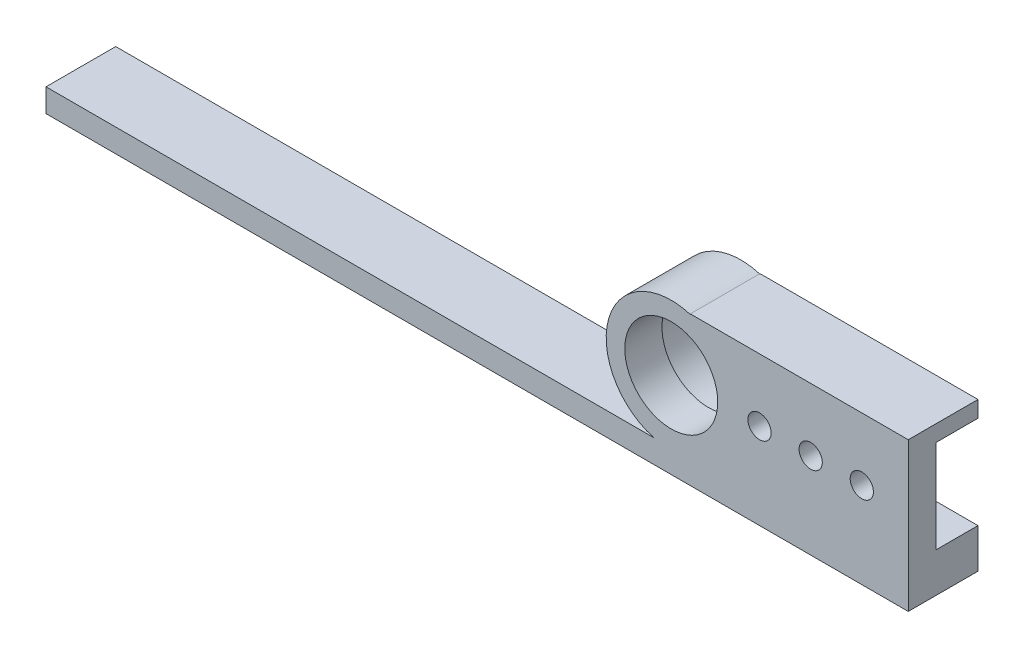
ISO-10303-21;
HEADER;
FILE_DESCRIPTION(('STEP AP214'),'2;1');
FILE_NAME('part.step','',(''),(''),'','','');
FILE_SCHEMA(('AUTOMOTIVE_DESIGN { 1 0 10303 214 1 1 1 1 }'));
ENDSEC;
DATA;
#1=APPLICATION_CONTEXT('core data for automotive mechanical design processes');
#2=APPLICATION_PROTOCOL_DEFINITION('international standard','automotive_design',2000,#1);
#3=PRODUCT_CONTEXT('',#1,'mechanical');
#4=PRODUCT('Part','Part','',(#3));
#5=PRODUCT_RELATED_PRODUCT_CATEGORY('part','',(#4));
#6=PRODUCT_DEFINITION_FORMATION('','',#4);
#7=PRODUCT_DEFINITION_CONTEXT('part definition',#1,'design');
#8=PRODUCT_DEFINITION('design','',#6,#7);
#9=PRODUCT_DEFINITION_SHAPE('','',#8);
#10=(LENGTH_UNIT() NAMED_UNIT(*) SI_UNIT(.MILLI.,.METRE.));
#11=(NAMED_UNIT(*) PLANE_ANGLE_UNIT() SI_UNIT($,.RADIAN.));
#12=(NAMED_UNIT(*) SI_UNIT($,.STERADIAN.) SOLID_ANGLE_UNIT());
#13=UNCERTAINTY_MEASURE_WITH_UNIT(LENGTH_MEASURE(1.E-05),#10,'distance_accuracy_value','');
#14=(GEOMETRIC_REPRESENTATION_CONTEXT(3) GLOBAL_UNCERTAINTY_ASSIGNED_CONTEXT((#13)) GLOBAL_UNIT_ASSIGNED_CONTEXT((#10,
#11,#12)) REPRESENTATION_CONTEXT('',''));
#15=CARTESIAN_POINT('',(0.,0.,0.));
#16=DIRECTION('',(0.,0.,1.));
#17=DIRECTION('',(1.,0.,0.));
#18=AXIS2_PLACEMENT_3D('',#15,#16,#17);
#19=CARTESIAN_POINT('',(-31.,0.,-9.));
#20=DIRECTION('',(0.,0.,1.));
#21=DIRECTION('',(1.,0.,0.));
#22=AXIS2_PLACEMENT_3D('',#19,#20,#21);
#23=CYLINDRICAL_SURFACE('',#22,14.);
#24=DIRECTION('',(0.,0.,1.));
#25=VECTOR('',#24,1.);
#26=CARTESIAN_POINT('',(-34.7080992435478,-13.5,-9.));
#27=LINE('',#26,#25);
#28=CARTESIAN_POINT('',(-34.7080992435478,-13.5,6.));
#29=VERTEX_POINT('',#28);
#30=CARTESIAN_POINT('',(-34.7080992435478,-13.5,-9.));
#31=VERTEX_POINT('',#30);
#32=EDGE_CURVE('E158',#29,#31,#27,.F.);
#33=ORIENTED_EDGE('',*,*,#32,.F.);
#34=CARTESIAN_POINT('',(-31.,0.,6.));
#35=DIRECTION('',(0.,0.,1.));
#36=DIRECTION('',(1.,0.,0.));
#37=AXIS2_PLACEMENT_3D('',#34,#35,#36);
#38=CIRCLE('',#37,14.);
#39=CARTESIAN_POINT('',(-26.8939671408107,13.3843376436512,6.));
#40=VERTEX_POINT('',#39);
#41=EDGE_CURVE('E177',#40,#29,#38,.T.);
#42=ORIENTED_EDGE('',*,*,#41,.F.);
#43=DIRECTION('',(0.,0.,1.));
#44=VECTOR('',#43,1.);
#45=CARTESIAN_POINT('',(-26.8939671408107,13.3843376436512,-9.));
#46=LINE('',#45,#44);
#47=CARTESIAN_POINT('',(-26.8939671408107,13.3843376436512,-9.));
#48=VERTEX_POINT('',#47);
#49=EDGE_CURVE('E222',#48,#40,#46,.T.);
#50=ORIENTED_EDGE('',*,*,#49,.F.);
#51=CARTESIAN_POINT('',(-31.,0.,-9.));
#52=DIRECTION('',(0.,0.,1.));
#53=DIRECTION('',(1.,0.,0.));
#54=AXIS2_PLACEMENT_3D('',#51,#52,#53);
#55=CIRCLE('',#54,14.);
#56=EDGE_CURVE('E193',#48,#31,#55,.T.);
#57=ORIENTED_EDGE('',*,*,#56,.T.);
#58=EDGE_LOOP('',(#33,#42,#50,#57));
#59=FACE_BOUND('',#58,.T.);
#60=ADVANCED_FACE('F42',(#59),#23,.T.);
#61=CARTESIAN_POINT('',(-31.,0.,-9.));
#62=DIRECTION('',(0.,0.,1.));
#63=DIRECTION('',(1.,0.,0.));
#64=AXIS2_PLACEMENT_3D('',#61,#62,#63);
#65=CYLINDRICAL_SURFACE('',#64,11.);
#66=CARTESIAN_POINT('',(-31.,0.,-9.));
#67=DIRECTION('',(0.,0.,1.));
#68=DIRECTION('',(1.,0.,0.));
#69=AXIS2_PLACEMENT_3D('',#66,#67,#68);
#70=CIRCLE('',#69,11.);
#71=CARTESIAN_POINT('',(-20.,0.,-9.));
#72=VERTEX_POINT('',#71);
#73=EDGE_CURVE('E173',#72,#72,#70,.T.);
#74=ORIENTED_EDGE('',*,*,#73,.F.);
#75=EDGE_LOOP('',(#74));
#76=FACE_BOUND('',#75,.T.);
#77=CARTESIAN_POINT('',(-31.,0.,-2.));
#78=DIRECTION('',(0.,0.,1.));
#79=DIRECTION('',(1.,0.,0.));
#80=AXIS2_PLACEMENT_3D('',#77,#78,#79);
#81=CIRCLE('',#80,11.);
#82=CARTESIAN_POINT('',(-20.,0.,-2.));
#83=VERTEX_POINT('',#82);
#84=EDGE_CURVE('E11',#83,#83,#81,.F.);
#85=ORIENTED_EDGE('',*,*,#84,.F.);
#86=EDGE_LOOP('',(#85));
#87=FACE_BOUND('',#86,.T.);
#88=ADVANCED_FACE('F319',(#76,#87),#65,.F.);
#89=CARTESIAN_POINT('',(20.,-10.,6.));
#90=DIRECTION('',(-1.,0.,0.));
#91=DIRECTION('',(0.,0.,1.));
#92=AXIS2_PLACEMENT_3D('',#89,#90,#91);
#93=PLANE('',#92);
#94=DIRECTION('',(0.,1.,0.));
#95=VECTOR('',#94,1.);
#96=CARTESIAN_POINT('',(20.,-10.,0.));
#97=LINE('',#96,#95);
#98=CARTESIAN_POINT('',(20.,-10.,0.));
#99=VERTEX_POINT('',#98);
#100=CARTESIAN_POINT('',(20.,10.,0.));
#101=VERTEX_POINT('',#100);
#102=EDGE_CURVE('E264',#99,#101,#97,.T.);
#103=ORIENTED_EDGE('',*,*,#102,.T.);
#104=DIRECTION('',(0.,0.,1.));
#105=VECTOR('',#104,1.);
#106=CARTESIAN_POINT('',(20.,10.,-9.));
#107=LINE('',#106,#105);
#108=CARTESIAN_POINT('',(20.,10.,-9.));
#109=VERTEX_POINT('',#108);
#110=EDGE_CURVE('E229',#109,#101,#107,.T.);
#111=ORIENTED_EDGE('',*,*,#110,.F.);
#112=DIRECTION('',(0.,-1.,0.));
#113=VECTOR('',#112,1.);
#114=CARTESIAN_POINT('',(20.,0.,-9.));
#115=LINE('',#114,#113);
#116=CARTESIAN_POINT('',(20.,13.5,-9.));
#117=VERTEX_POINT('',#116);
#118=EDGE_CURVE('E185',#117,#109,#115,.T.);
#119=ORIENTED_EDGE('',*,*,#118,.F.);
#120=DIRECTION('',(0.,0.,1.));
#121=VECTOR('',#120,1.);
#122=CARTESIAN_POINT('',(20.,13.5,-9.));
#123=LINE('',#122,#121);
#124=CARTESIAN_POINT('',(20.,13.5,6.));
#125=VERTEX_POINT('',#124);
#126=EDGE_CURVE('E226',#117,#125,#123,.T.);
#127=ORIENTED_EDGE('',*,*,#126,.T.);
#128=DIRECTION('',(0.,1.,0.));
#129=VECTOR('',#128,1.);
#130=CARTESIAN_POINT('',(20.,-10.,6.));
#131=LINE('',#130,#129);
#132=CARTESIAN_POINT('',(20.,-18.5,6.));
#133=VERTEX_POINT('',#132);
#134=EDGE_CURVE('E255',#133,#125,#131,.T.);
#135=ORIENTED_EDGE('',*,*,#134,.F.);
#136=DIRECTION('',(0.,0.,-1.));
#137=VECTOR('',#136,1.);
#138=CARTESIAN_POINT('',(20.,-18.5,-9.));
#139=LINE('',#138,#137);
#140=CARTESIAN_POINT('',(20.,-18.5,-9.));
#141=VERTEX_POINT('',#140);
#142=EDGE_CURVE('E151',#133,#141,#139,.T.);
#143=ORIENTED_EDGE('',*,*,#142,.T.);
#144=DIRECTION('',(0.,-1.,0.));
#145=VECTOR('',#144,1.);
#146=CARTESIAN_POINT('',(20.,0.,-9.));
#147=LINE('',#146,#145);
#148=CARTESIAN_POINT('',(20.,-10.,-9.));
#149=VERTEX_POINT('',#148);
#150=EDGE_CURVE('E196',#149,#141,#147,.T.);
#151=ORIENTED_EDGE('',*,*,#150,.F.);
#152=DIRECTION('',(0.,0.,1.));
#153=VECTOR('',#152,1.);
#154=CARTESIAN_POINT('',(20.,-10.,-9.));
#155=LINE('',#154,#153);
#156=EDGE_CURVE('E219',#149,#99,#155,.T.);
#157=ORIENTED_EDGE('',*,*,#156,.T.);
#158=EDGE_LOOP('',(#103,#111,#119,#127,#135,#143,#151,#157));
#159=FACE_BOUND('',#158,.T.);
#160=ADVANCED_FACE('F44',(#159),#93,.F.);
#161=CARTESIAN_POINT('',(0.,0.,6.));
#162=DIRECTION('',(0.,0.,1.));
#163=DIRECTION('',(1.,0.,0.));
#164=AXIS2_PLACEMENT_3D('',#161,#162,#163);
#165=PLANE('',#164);
#166=DIRECTION('',(0.,1.,0.));
#167=VECTOR('',#166,1.);
#168=CARTESIAN_POINT('',(-165.520464845144,0.,6.));
#169=LINE('',#168,#167);
#170=CARTESIAN_POINT('',(-165.520464845144,-18.5,5.99999999999995));
#171=VERTEX_POINT('',#170);
#172=CARTESIAN_POINT('',(-165.520464845144,-13.5,6.));
#173=VERTEX_POINT('',#172);
#174=EDGE_CURVE('E139',#171,#173,#169,.T.);
#175=ORIENTED_EDGE('',*,*,#174,.F.);
#176=DIRECTION('',(1.,0.,0.));
#177=VECTOR('',#176,1.);
#178=CARTESIAN_POINT('',(-480.,-18.5,6.));
#179=LINE('',#178,#177);
#180=EDGE_CURVE('E148',#171,#133,#179,.T.);
#181=ORIENTED_EDGE('',*,*,#180,.T.);
#182=ORIENTED_EDGE('',*,*,#134,.T.);
#183=DIRECTION('',(-1.,0.,0.));
#184=VECTOR('',#183,1.);
#185=CARTESIAN_POINT('',(0.,13.5,6.));
#186=LINE('',#185,#184);
#187=CARTESIAN_POINT('',(-26.8939671408107,13.5,6.));
#188=VERTEX_POINT('',#187);
#189=EDGE_CURVE('E170',#125,#188,#186,.T.);
#190=ORIENTED_EDGE('',*,*,#189,.T.);
#191=DIRECTION('',(0.,1.,0.));
#192=VECTOR('',#191,1.);
#193=CARTESIAN_POINT('',(-26.8939671408107,0.,6.));
#194=LINE('',#193,#192);
#195=EDGE_CURVE('E208',#40,#188,#194,.T.);
#196=ORIENTED_EDGE('',*,*,#195,.F.);
#197=ORIENTED_EDGE('',*,*,#41,.T.);
#198=DIRECTION('',(1.,0.,0.));
#199=VECTOR('',#198,1.);
#200=CARTESIAN_POINT('',(-480.,-13.5,6.));
#201=LINE('',#200,#199);
#202=EDGE_CURVE('E65',#173,#29,#201,.T.);
#203=ORIENTED_EDGE('',*,*,#202,.F.);
#204=EDGE_LOOP('',(#175,#181,#182,#190,#196,#197,#203));
#205=FACE_BOUND('',#204,.T.);
#206=CARTESIAN_POINT('',(10.,0.,6.));
#207=DIRECTION('',(0.,0.,1.));
#208=DIRECTION('',(1.,0.,0.));
#209=AXIS2_PLACEMENT_3D('',#206,#207,#208);
#210=CIRCLE('',#209,2.5);
#211=CARTESIAN_POINT('',(12.5,0.,6.));
#212=VERTEX_POINT('',#211);
#213=EDGE_CURVE('E241',#212,#212,#210,.T.);
#214=ORIENTED_EDGE('',*,*,#213,.F.);
#215=EDGE_LOOP('',(#214));
#216=FACE_BOUND('',#215,.T.);
#217=CARTESIAN_POINT('',(-0.999999999999999,0.,6.));
#218=DIRECTION('',(0.,0.,1.));
#219=DIRECTION('',(1.,0.,0.));
#220=AXIS2_PLACEMENT_3D('',#217,#218,#219);
#221=CIRCLE('',#220,2.5);
#222=CARTESIAN_POINT('',(1.5,0.,6.));
#223=VERTEX_POINT('',#222);
#224=EDGE_CURVE('E244',#223,#223,#221,.T.);
#225=ORIENTED_EDGE('',*,*,#224,.F.);
#226=EDGE_LOOP('',(#225));
#227=FACE_BOUND('',#226,.T.);
#228=CARTESIAN_POINT('',(-12.,-1.53625178909098E-13,6.));
#229=DIRECTION('',(0.,0.,1.));
#230=DIRECTION('',(1.,0.,0.));
#231=AXIS2_PLACEMENT_3D('',#228,#229,#230);
#232=CIRCLE('',#231,2.5);
#233=CARTESIAN_POINT('',(-9.5,-1.53625178909098E-13,6.));
#234=VERTEX_POINT('',#233);
#235=EDGE_CURVE('E250',#234,#234,#232,.T.);
#236=ORIENTED_EDGE('',*,*,#235,.F.);
#237=EDGE_LOOP('',(#236));
#238=FACE_BOUND('',#237,.T.);
#239=CARTESIAN_POINT('',(-31.,0.,6.));
#240=DIRECTION('',(0.,0.,1.));
#241=DIRECTION('',(1.,0.,0.));
#242=AXIS2_PLACEMENT_3D('',#239,#240,#241);
#243=CIRCLE('',#242,10.);
#244=CARTESIAN_POINT('',(-21.,0.,6.));
#245=VERTEX_POINT('',#244);
#246=EDGE_CURVE('E166',#245,#245,#243,.T.);
#247=ORIENTED_EDGE('',*,*,#246,.F.);
#248=EDGE_LOOP('',(#247));
#249=FACE_BOUND('',#248,.T.);
#250=ADVANCED_FACE('F146',(#205,#216,#227,#238,#249),#165,.T.);
#251=CARTESIAN_POINT('',(0.,0.,0.));
#252=DIRECTION('',(0.,0.,1.));
#253=DIRECTION('',(1.,0.,0.));
#254=AXIS2_PLACEMENT_3D('',#251,#252,#253);
#255=PLANE('',#254);
#256=CARTESIAN_POINT('',(10.,0.,0.));
#257=DIRECTION('',(0.,0.,1.));
#258=DIRECTION('',(1.,0.,0.));
#259=AXIS2_PLACEMENT_3D('',#256,#257,#258);
#260=CIRCLE('',#259,2.5);
#261=CARTESIAN_POINT('',(12.5,0.,0.));
#262=VERTEX_POINT('',#261);
#263=EDGE_CURVE('E237',#262,#262,#260,.T.);
#264=ORIENTED_EDGE('',*,*,#263,.T.);
#265=EDGE_LOOP('',(#264));
#266=FACE_BOUND('',#265,.T.);
#267=CARTESIAN_POINT('',(-0.999999999999999,0.,0.));
#268=DIRECTION('',(0.,0.,1.));
#269=DIRECTION('',(1.,0.,0.));
#270=AXIS2_PLACEMENT_3D('',#267,#268,#269);
#271=CIRCLE('',#270,2.5);
#272=CARTESIAN_POINT('',(1.5,0.,0.));
#273=VERTEX_POINT('',#272);
#274=EDGE_CURVE('E247',#273,#273,#271,.T.);
#275=ORIENTED_EDGE('',*,*,#274,.T.);
#276=EDGE_LOOP('',(#275));
#277=FACE_BOUND('',#276,.T.);
#278=CARTESIAN_POINT('',(-12.,-1.53625178909098E-13,0.));
#279=DIRECTION('',(0.,0.,1.));
#280=DIRECTION('',(1.,0.,0.));
#281=AXIS2_PLACEMENT_3D('',#278,#279,#280);
#282=CIRCLE('',#281,2.5);
#283=CARTESIAN_POINT('',(-9.5,-1.53625178909098E-13,0.));
#284=VERTEX_POINT('',#283);
#285=EDGE_CURVE('E215',#284,#284,#282,.T.);
#286=ORIENTED_EDGE('',*,*,#285,.T.);
#287=EDGE_LOOP('',(#286));
#288=FACE_BOUND('',#287,.T.);
#289=DIRECTION('',(0.,-1.,0.));
#290=VECTOR('',#289,1.);
#291=CARTESIAN_POINT('',(-20.,-10.,0.));
#292=LINE('',#291,#290);
#293=CARTESIAN_POINT('',(-20.,-8.66025403784439,0.));
#294=VERTEX_POINT('',#293);
#295=CARTESIAN_POINT('',(-20.,-10.,0.));
#296=VERTEX_POINT('',#295);
#297=EDGE_CURVE('E240',#294,#296,#292,.T.);
#298=ORIENTED_EDGE('',*,*,#297,.F.);
#299=CARTESIAN_POINT('',(-31.,0.,0.));
#300=DIRECTION('',(0.,0.,1.));
#301=DIRECTION('',(1.,0.,0.));
#302=AXIS2_PLACEMENT_3D('',#299,#300,#301);
#303=CIRCLE('',#302,14.);
#304=CARTESIAN_POINT('',(-20.,8.66025403784439,0.));
#305=VERTEX_POINT('',#304);
#306=EDGE_CURVE('E50',#294,#305,#303,.T.);
#307=ORIENTED_EDGE('',*,*,#306,.T.);
#308=CARTESIAN_POINT('',(-20.,10.,0.));
#309=VERTEX_POINT('',#308);
#310=EDGE_CURVE('E258',#309,#305,#292,.T.);
#311=ORIENTED_EDGE('',*,*,#310,.F.);
#312=DIRECTION('',(-1.,0.,0.));
#313=VECTOR('',#312,1.);
#314=CARTESIAN_POINT('',(20.,10.,0.));
#315=LINE('',#314,#313);
#316=EDGE_CURVE('E257',#101,#309,#315,.T.);
#317=ORIENTED_EDGE('',*,*,#316,.F.);
#318=ORIENTED_EDGE('',*,*,#102,.F.);
#319=DIRECTION('',(1.,0.,0.));
#320=VECTOR('',#319,1.);
#321=CARTESIAN_POINT('',(20.,-10.,0.));
#322=LINE('',#321,#320);
#323=EDGE_CURVE('E261',#296,#99,#322,.T.);
#324=ORIENTED_EDGE('',*,*,#323,.F.);
#325=EDGE_LOOP('',(#298,#307,#311,#317,#318,#324));
#326=FACE_BOUND('',#325,.T.);
#327=ADVANCED_FACE('F269',(#266,#277,#288,#326),#255,.F.);
#328=CARTESIAN_POINT('',(-12.,-1.53625178909098E-13,0.));
#329=DIRECTION('',(0.,0.,1.));
#330=DIRECTION('',(1.,0.,0.));
#331=AXIS2_PLACEMENT_3D('',#328,#329,#330);
#332=CYLINDRICAL_SURFACE('',#331,2.5);
#333=ORIENTED_EDGE('',*,*,#285,.F.);
#334=EDGE_LOOP('',(#333));
#335=FACE_BOUND('',#334,.T.);
#336=ORIENTED_EDGE('',*,*,#235,.T.);
#337=EDGE_LOOP('',(#336));
#338=FACE_BOUND('',#337,.T.);
#339=ADVANCED_FACE('F492',(#335,#338),#332,.F.);
#340=CARTESIAN_POINT('',(-0.999999999999999,0.,0.));
#341=DIRECTION('',(0.,0.,1.));
#342=DIRECTION('',(1.,0.,0.));
#343=AXIS2_PLACEMENT_3D('',#340,#341,#342);
#344=CYLINDRICAL_SURFACE('',#343,2.5);
#345=ORIENTED_EDGE('',*,*,#274,.F.);
#346=EDGE_LOOP('',(#345));
#347=FACE_BOUND('',#346,.T.);
#348=ORIENTED_EDGE('',*,*,#224,.T.);
#349=EDGE_LOOP('',(#348));
#350=FACE_BOUND('',#349,.T.);
#351=ADVANCED_FACE('F481',(#347,#350),#344,.F.);
#352=CARTESIAN_POINT('',(10.,0.,0.));
#353=DIRECTION('',(0.,0.,1.));
#354=DIRECTION('',(1.,0.,0.));
#355=AXIS2_PLACEMENT_3D('',#352,#353,#354);
#356=CYLINDRICAL_SURFACE('',#355,2.5);
#357=ORIENTED_EDGE('',*,*,#263,.F.);
#358=EDGE_LOOP('',(#357));
#359=FACE_BOUND('',#358,.T.);
#360=ORIENTED_EDGE('',*,*,#213,.T.);
#361=EDGE_LOOP('',(#360));
#362=FACE_BOUND('',#361,.T.);
#363=ADVANCED_FACE('F471',(#359,#362),#356,.F.);
#364=CARTESIAN_POINT('',(-31.,0.,-9.));
#365=DIRECTION('',(0.,0.,1.));
#366=DIRECTION('',(1.,0.,0.));
#367=AXIS2_PLACEMENT_3D('',#364,#365,#366);
#368=CYLINDRICAL_SURFACE('',#367,14.);
#369=ORIENTED_EDGE('',*,*,#306,.F.);
#370=DIRECTION('',(0.,0.,1.));
#371=VECTOR('',#370,1.);
#372=CARTESIAN_POINT('',(-20.,-8.66025403784439,-9.));
#373=LINE('',#372,#371);
#374=CARTESIAN_POINT('',(-20.,-8.66025403784439,-9.));
#375=VERTEX_POINT('',#374);
#376=EDGE_CURVE('E212',#375,#294,#373,.T.);
#377=ORIENTED_EDGE('',*,*,#376,.F.);
#378=CARTESIAN_POINT('',(-31.,0.,-9.));
#379=DIRECTION('',(0.,0.,1.));
#380=DIRECTION('',(1.,0.,0.));
#381=AXIS2_PLACEMENT_3D('',#378,#379,#380);
#382=CIRCLE('',#381,14.);
#383=CARTESIAN_POINT('',(-20.,8.66025403784439,-9.));
#384=VERTEX_POINT('',#383);
#385=EDGE_CURVE('E176',#375,#384,#382,.T.);
#386=ORIENTED_EDGE('',*,*,#385,.T.);
#387=DIRECTION('',(0.,0.,1.));
#388=VECTOR('',#387,1.);
#389=CARTESIAN_POINT('',(-20.,8.66025403784439,-9.));
#390=LINE('',#389,#388);
#391=EDGE_CURVE('E205',#384,#305,#390,.T.);
#392=ORIENTED_EDGE('',*,*,#391,.T.);
#393=EDGE_LOOP('',(#369,#377,#386,#392));
#394=FACE_BOUND('',#393,.T.);
#395=ADVANCED_FACE('F277',(#394),#368,.T.);
#396=CARTESIAN_POINT('',(-20.,0.,-9.));
#397=DIRECTION('',(-1.,0.,0.));
#398=DIRECTION('',(0.,0.,1.));
#399=AXIS2_PLACEMENT_3D('',#396,#397,#398);
#400=PLANE('',#399);
#401=ORIENTED_EDGE('',*,*,#376,.T.);
#402=ORIENTED_EDGE('',*,*,#297,.T.);
#403=DIRECTION('',(0.,0.,1.));
#404=VECTOR('',#403,1.);
#405=CARTESIAN_POINT('',(-20.,-10.,-9.));
#406=LINE('',#405,#404);
#407=CARTESIAN_POINT('',(-20.,-10.,-9.));
#408=VERTEX_POINT('',#407);
#409=EDGE_CURVE('E216',#408,#296,#406,.T.);
#410=ORIENTED_EDGE('',*,*,#409,.F.);
#411=DIRECTION('',(0.,-1.,0.));
#412=VECTOR('',#411,1.);
#413=CARTESIAN_POINT('',(-20.,0.,-9.));
#414=LINE('',#413,#412);
#415=EDGE_CURVE('E202',#375,#408,#414,.T.);
#416=ORIENTED_EDGE('',*,*,#415,.F.);
#417=EDGE_LOOP('',(#401,#402,#410,#416));
#418=FACE_BOUND('',#417,.T.);
#419=ADVANCED_FACE('F329',(#418),#400,.F.);
#420=CARTESIAN_POINT('',(0.,-10.,-9.));
#421=DIRECTION('',(0.,-1.,0.));
#422=DIRECTION('',(1.,0.,0.));
#423=AXIS2_PLACEMENT_3D('',#420,#421,#422);
#424=PLANE('',#423);
#425=ORIENTED_EDGE('',*,*,#409,.T.);
#426=ORIENTED_EDGE('',*,*,#323,.T.);
#427=ORIENTED_EDGE('',*,*,#156,.F.);
#428=DIRECTION('',(1.,0.,0.));
#429=VECTOR('',#428,1.);
#430=CARTESIAN_POINT('',(0.,-10.,-9.));
#431=LINE('',#430,#429);
#432=EDGE_CURVE('E199',#408,#149,#431,.T.);
#433=ORIENTED_EDGE('',*,*,#432,.F.);
#434=EDGE_LOOP('',(#425,#426,#427,#433));
#435=FACE_BOUND('',#434,.T.);
#436=ADVANCED_FACE('F291',(#435),#424,.F.);
#437=CARTESIAN_POINT('',(0.,10.,-9.));
#438=DIRECTION('',(0.,1.,0.));
#439=DIRECTION('',(-1.,0.,0.));
#440=AXIS2_PLACEMENT_3D('',#437,#438,#439);
#441=PLANE('',#440);
#442=ORIENTED_EDGE('',*,*,#110,.T.);
#443=ORIENTED_EDGE('',*,*,#316,.T.);
#444=DIRECTION('',(0.,0.,1.));
#445=VECTOR('',#444,1.);
#446=CARTESIAN_POINT('',(-20.,10.,-9.));
#447=LINE('',#446,#445);
#448=CARTESIAN_POINT('',(-20.,10.,-9.));
#449=VERTEX_POINT('',#448);
#450=EDGE_CURVE('E232',#449,#309,#447,.T.);
#451=ORIENTED_EDGE('',*,*,#450,.F.);
#452=DIRECTION('',(-1.,0.,0.));
#453=VECTOR('',#452,1.);
#454=CARTESIAN_POINT('',(0.,10.,-9.));
#455=LINE('',#454,#453);
#456=EDGE_CURVE('E182',#109,#449,#455,.T.);
#457=ORIENTED_EDGE('',*,*,#456,.F.);
#458=EDGE_LOOP('',(#442,#443,#451,#457));
#459=FACE_BOUND('',#458,.T.);
#460=ADVANCED_FACE('F287',(#459),#441,.F.);
#461=CARTESIAN_POINT('',(-20.,0.,-9.));
#462=DIRECTION('',(-1.,0.,0.));
#463=DIRECTION('',(0.,0.,1.));
#464=AXIS2_PLACEMENT_3D('',#461,#462,#463);
#465=PLANE('',#464);
#466=ORIENTED_EDGE('',*,*,#450,.T.);
#467=ORIENTED_EDGE('',*,*,#310,.T.);
#468=ORIENTED_EDGE('',*,*,#391,.F.);
#469=DIRECTION('',(0.,-1.,0.));
#470=VECTOR('',#469,1.);
#471=CARTESIAN_POINT('',(-20.,0.,-9.));
#472=LINE('',#471,#470);
#473=EDGE_CURVE('E180',#449,#384,#472,.T.);
#474=ORIENTED_EDGE('',*,*,#473,.F.);
#475=EDGE_LOOP('',(#466,#467,#468,#474));
#476=FACE_BOUND('',#475,.T.);
#477=ADVANCED_FACE('F275',(#476),#465,.F.);
#478=CARTESIAN_POINT('',(-26.8939671408107,0.,-9.));
#479=DIRECTION('',(1.,0.,0.));
#480=DIRECTION('',(0.,0.,-1.));
#481=AXIS2_PLACEMENT_3D('',#478,#479,#480);
#482=PLANE('',#481);
#483=ORIENTED_EDGE('',*,*,#195,.T.);
#484=DIRECTION('',(0.,0.,1.));
#485=VECTOR('',#484,1.);
#486=CARTESIAN_POINT('',(-26.8939671408107,13.5,-9.));
#487=LINE('',#486,#485);
#488=CARTESIAN_POINT('',(-26.8939671408107,13.5,-9.));
#489=VERTEX_POINT('',#488);
#490=EDGE_CURVE('E224',#489,#188,#487,.T.);
#491=ORIENTED_EDGE('',*,*,#490,.F.);
#492=DIRECTION('',(0.,1.,0.));
#493=VECTOR('',#492,1.);
#494=CARTESIAN_POINT('',(-26.8939671408107,0.,-9.));
#495=LINE('',#494,#493);
#496=EDGE_CURVE('E191',#48,#489,#495,.T.);
#497=ORIENTED_EDGE('',*,*,#496,.F.);
#498=ORIENTED_EDGE('',*,*,#49,.T.);
#499=EDGE_LOOP('',(#483,#491,#497,#498));
#500=FACE_BOUND('',#499,.T.);
#501=ADVANCED_FACE('F302',(#500),#482,.F.);
#502=CARTESIAN_POINT('',(0.,13.5,-9.));
#503=DIRECTION('',(0.,1.,0.));
#504=DIRECTION('',(-1.,0.,0.));
#505=AXIS2_PLACEMENT_3D('',#502,#503,#504);
#506=PLANE('',#505);
#507=ORIENTED_EDGE('',*,*,#189,.F.);
#508=ORIENTED_EDGE('',*,*,#126,.F.);
#509=DIRECTION('',(-1.,0.,0.));
#510=VECTOR('',#509,1.);
#511=CARTESIAN_POINT('',(0.,13.5,-9.));
#512=LINE('',#511,#510);
#513=EDGE_CURVE('E188',#117,#489,#512,.T.);
#514=ORIENTED_EDGE('',*,*,#513,.T.);
#515=ORIENTED_EDGE('',*,*,#490,.T.);
#516=EDGE_LOOP('',(#507,#508,#514,#515));
#517=FACE_BOUND('',#516,.T.);
#518=ADVANCED_FACE('F305',(#517),#506,.T.);
#519=CARTESIAN_POINT('',(0.,0.,-9.));
#520=DIRECTION('',(0.,0.,1.));
#521=DIRECTION('',(1.,0.,0.));
#522=AXIS2_PLACEMENT_3D('',#519,#520,#521);
#523=PLANE('',#522);
#524=ORIENTED_EDGE('',*,*,#73,.T.);
#525=EDGE_LOOP('',(#524));
#526=FACE_BOUND('',#525,.T.);
#527=DIRECTION('',(1.,0.,0.));
#528=VECTOR('',#527,1.);
#529=CARTESIAN_POINT('',(-480.,-18.5,-9.));
#530=LINE('',#529,#528);
#531=CARTESIAN_POINT('',(-165.520464845144,-18.5,-9.));
#532=VERTEX_POINT('',#531);
#533=EDGE_CURVE('E156',#532,#141,#530,.T.);
#534=ORIENTED_EDGE('',*,*,#533,.F.);
#535=DIRECTION('',(0.,1.,0.));
#536=VECTOR('',#535,1.);
#537=CARTESIAN_POINT('',(-165.520464845144,0.,-9.));
#538=LINE('',#537,#536);
#539=CARTESIAN_POINT('',(-165.520464845144,-13.5,-9.));
#540=VERTEX_POINT('',#539);
#541=EDGE_CURVE('E57',#532,#540,#538,.T.);
#542=ORIENTED_EDGE('',*,*,#541,.T.);
#543=DIRECTION('',(1.,0.,0.));
#544=VECTOR('',#543,1.);
#545=CARTESIAN_POINT('',(-480.,-13.5,-9.));
#546=LINE('',#545,#544);
#547=EDGE_CURVE('E160',#540,#31,#546,.T.);
#548=ORIENTED_EDGE('',*,*,#547,.T.);
#549=ORIENTED_EDGE('',*,*,#56,.F.);
#550=ORIENTED_EDGE('',*,*,#496,.T.);
#551=ORIENTED_EDGE('',*,*,#513,.F.);
#552=ORIENTED_EDGE('',*,*,#118,.T.);
#553=ORIENTED_EDGE('',*,*,#456,.T.);
#554=ORIENTED_EDGE('',*,*,#473,.T.);
#555=ORIENTED_EDGE('',*,*,#385,.F.);
#556=ORIENTED_EDGE('',*,*,#415,.T.);
#557=ORIENTED_EDGE('',*,*,#432,.T.);
#558=ORIENTED_EDGE('',*,*,#150,.T.);
#559=EDGE_LOOP('',(#534,#542,#548,#549,#550,#551,#552,#553,#554,#555,#556,#557,#558));
#560=FACE_BOUND('',#559,.T.);
#561=ADVANCED_FACE('F281',(#526,#560),#523,.F.);
#562=CARTESIAN_POINT('',(-31.,0.,-2.));
#563=DIRECTION('',(0.,0.,1.));
#564=DIRECTION('',(1.,0.,0.));
#565=AXIS2_PLACEMENT_3D('',#562,#563,#564);
#566=PLANE('',#565);
#567=CARTESIAN_POINT('',(-31.,0.,-2.));
#568=DIRECTION('',(0.,0.,1.));
#569=DIRECTION('',(1.,0.,0.));
#570=AXIS2_PLACEMENT_3D('',#567,#568,#569);
#571=CIRCLE('',#570,10.);
#572=CARTESIAN_POINT('',(-21.,0.,-2.));
#573=VERTEX_POINT('',#572);
#574=EDGE_CURVE('E167',#573,#573,#571,.T.);
#575=ORIENTED_EDGE('',*,*,#574,.T.);
#576=EDGE_LOOP('',(#575));
#577=FACE_BOUND('',#576,.T.);
#578=ORIENTED_EDGE('',*,*,#84,.T.);
#579=EDGE_LOOP('',(#578));
#580=FACE_BOUND('',#579,.T.);
#581=ADVANCED_FACE('F313',(#577,#580),#566,.F.);
#582=CARTESIAN_POINT('',(-31.,0.,-2.));
#583=DIRECTION('',(0.,0.,1.));
#584=DIRECTION('',(1.,0.,0.));
#585=AXIS2_PLACEMENT_3D('',#582,#583,#584);
#586=CYLINDRICAL_SURFACE('',#585,10.);
#587=ORIENTED_EDGE('',*,*,#574,.F.);
#588=EDGE_LOOP('',(#587));
#589=FACE_BOUND('',#588,.T.);
#590=ORIENTED_EDGE('',*,*,#246,.T.);
#591=EDGE_LOOP('',(#590));
#592=FACE_BOUND('',#591,.T.);
#593=ADVANCED_FACE('F335',(#589,#592),#586,.F.);
#594=CARTESIAN_POINT('',(-480.,-13.5,-9.));
#595=DIRECTION('',(0.,1.,0.));
#596=DIRECTION('',(0.,0.,1.));
#597=AXIS2_PLACEMENT_3D('',#594,#595,#596);
#598=PLANE('',#597);
#599=DIRECTION('',(0.,0.,-1.));
#600=VECTOR('',#599,1.);
#601=CARTESIAN_POINT('',(-165.520464845144,-13.5,-9.));
#602=LINE('',#601,#600);
#603=EDGE_CURVE('E143',#173,#540,#602,.T.);
#604=ORIENTED_EDGE('',*,*,#603,.F.);
#605=ORIENTED_EDGE('',*,*,#202,.T.);
#606=ORIENTED_EDGE('',*,*,#32,.T.);
#607=ORIENTED_EDGE('',*,*,#547,.F.);
#608=EDGE_LOOP('',(#604,#605,#606,#607));
#609=FACE_BOUND('',#608,.T.);
#610=ADVANCED_FACE('F295',(#609),#598,.T.);
#611=CARTESIAN_POINT('',(-480.,-18.5,-9.));
#612=DIRECTION('',(0.,-1.,0.));
#613=DIRECTION('',(0.,0.,-1.));
#614=AXIS2_PLACEMENT_3D('',#611,#612,#613);
#615=PLANE('',#614);
#616=DIRECTION('',(0.,0.,1.));
#617=VECTOR('',#616,1.);
#618=CARTESIAN_POINT('',(-165.520464845144,-18.5,-220.208921237152));
#619=LINE('',#618,#617);
#620=EDGE_CURVE('E136',#532,#171,#619,.T.);
#621=ORIENTED_EDGE('',*,*,#620,.F.);
#622=ORIENTED_EDGE('',*,*,#533,.T.);
#623=ORIENTED_EDGE('',*,*,#142,.F.);
#624=ORIENTED_EDGE('',*,*,#180,.F.);
#625=EDGE_LOOP('',(#621,#622,#623,#624));
#626=FACE_BOUND('',#625,.T.);
#627=ADVANCED_FACE('F154',(#626),#615,.T.);
#628=CARTESIAN_POINT('',(-165.520464845144,14.0000000000001,-220.208921237152));
#629=DIRECTION('',(1.,0.,0.));
#630=DIRECTION('',(0.,0.,-1.));
#631=AXIS2_PLACEMENT_3D('',#628,#629,#630);
#632=PLANE('',#631);
#633=ORIENTED_EDGE('',*,*,#174,.T.);
#634=ORIENTED_EDGE('',*,*,#603,.T.);
#635=ORIENTED_EDGE('',*,*,#541,.F.);
#636=ORIENTED_EDGE('',*,*,#620,.T.);
#637=EDGE_LOOP('',(#633,#634,#635,#636));
#638=FACE_BOUND('',#637,.T.);
#639=ADVANCED_FACE('F138',(#638),#632,.F.);
#640=CLOSED_SHELL('',(#60,#88,#160,#250,#327,#339,#351,#363,#395,#419,#436,#460,#477,#501,#518,
#561,#581,#593,#610,#627,#639));
#641=MANIFOLD_SOLID_BREP('B2',#640);
#642=ADVANCED_BREP_SHAPE_REPRESENTATION('',(#18,#641),#14);
#643=SHAPE_DEFINITION_REPRESENTATION(#9,#642);
ENDSEC;
END-ISO-10303-21;
